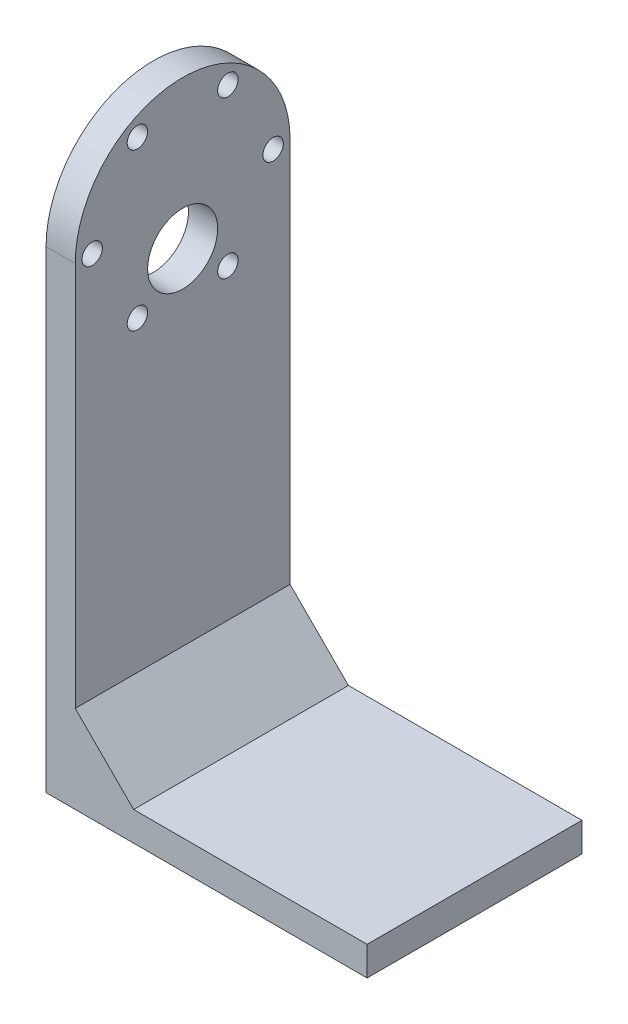
ISO-10303-21;
HEADER;
FILE_DESCRIPTION(('STEP AP214'),'2;1');
FILE_NAME('part.step','',(''),(''),'','','');
FILE_SCHEMA(('AUTOMOTIVE_DESIGN { 1 0 10303 214 1 1 1 1 }'));
ENDSEC;
DATA;
#1=APPLICATION_CONTEXT('core data for automotive mechanical design processes');
#2=APPLICATION_PROTOCOL_DEFINITION('international standard','automotive_design',2000,#1);
#3=PRODUCT_CONTEXT('',#1,'mechanical');
#4=PRODUCT('Part','Part','',(#3));
#5=PRODUCT_RELATED_PRODUCT_CATEGORY('part','',(#4));
#6=PRODUCT_DEFINITION_FORMATION('','',#4);
#7=PRODUCT_DEFINITION_CONTEXT('part definition',#1,'design');
#8=PRODUCT_DEFINITION('design','',#6,#7);
#9=PRODUCT_DEFINITION_SHAPE('','',#8);
#10=(LENGTH_UNIT() NAMED_UNIT(*) SI_UNIT(.MILLI.,.METRE.));
#11=(NAMED_UNIT(*) PLANE_ANGLE_UNIT() SI_UNIT($,.RADIAN.));
#12=(NAMED_UNIT(*) SI_UNIT($,.STERADIAN.) SOLID_ANGLE_UNIT());
#13=UNCERTAINTY_MEASURE_WITH_UNIT(LENGTH_MEASURE(1.E-05),#10,'distance_accuracy_value','');
#14=(GEOMETRIC_REPRESENTATION_CONTEXT(3) GLOBAL_UNCERTAINTY_ASSIGNED_CONTEXT((#13)) GLOBAL_UNIT_ASSIGNED_CONTEXT((#10,
#11,#12)) REPRESENTATION_CONTEXT('',''));
#15=CARTESIAN_POINT('',(0.,0.,0.));
#16=DIRECTION('',(0.,0.,1.));
#17=DIRECTION('',(1.,0.,0.));
#18=AXIS2_PLACEMENT_3D('',#15,#16,#17);
#19=CARTESIAN_POINT('',(747.608350006084,0.,1104.06011138059));
#20=DIRECTION('',(0.,0.,1.));
#21=DIRECTION('',(1.,0.,0.));
#22=AXIS2_PLACEMENT_3D('',#19,#20,#21);
#23=PLANE('',#22);
#24=DIRECTION('',(0.,-1.,0.));
#25=VECTOR('',#24,1.);
#26=CARTESIAN_POINT('',(752.608350006084,0.,1104.06011138059));
#27=LINE('',#26,#25);
#28=CARTESIAN_POINT('',(752.608350006084,-1919.,1104.06011138059));
#29=VERTEX_POINT('',#28);
#30=CARTESIAN_POINT('',(752.608350006084,-1985.,1104.06011138059));
#31=VERTEX_POINT('',#30);
#32=EDGE_CURVE('E131',#29,#31,#27,.T.);
#33=ORIENTED_EDGE('',*,*,#32,.T.);
#34=DIRECTION('',(0.707106781186553,-0.707106781186542,0.));
#35=VECTOR('',#34,1.);
#36=CARTESIAN_POINT('',(-242.391649993915,-990.000000000014,1104.06011138059));
#37=LINE('',#36,#35);
#38=CARTESIAN_POINT('',(762.608350006084,-1995.,1104.06011138059));
#39=VERTEX_POINT('',#38);
#40=EDGE_CURVE('E52',#31,#39,#37,.T.);
#41=ORIENTED_EDGE('',*,*,#40,.T.);
#42=DIRECTION('',(-1.,0.,0.));
#43=VECTOR('',#42,1.);
#44=CARTESIAN_POINT('',(802.608350006084,-1995.,1104.06011138059));
#45=LINE('',#44,#43);
#46=CARTESIAN_POINT('',(802.608350006084,-1995.,1104.06011138059));
#47=VERTEX_POINT('',#46);
#48=EDGE_CURVE('E123',#47,#39,#45,.T.);
#49=ORIENTED_EDGE('',*,*,#48,.F.);
#50=DIRECTION('',(0.,-1.,0.));
#51=VECTOR('',#50,1.);
#52=CARTESIAN_POINT('',(802.608350006084,-2000.,1104.06011138059));
#53=LINE('',#52,#51);
#54=CARTESIAN_POINT('',(802.608350006084,-2000.,1104.06011138059));
#55=VERTEX_POINT('',#54);
#56=EDGE_CURVE('E118',#47,#55,#53,.T.);
#57=ORIENTED_EDGE('',*,*,#56,.T.);
#58=DIRECTION('',(1.,0.,0.));
#59=VECTOR('',#58,1.);
#60=CARTESIAN_POINT('',(747.608350006084,-2000.,1104.06011138059));
#61=LINE('',#60,#59);
#62=CARTESIAN_POINT('',(747.608350006084,-2000.,1104.06011138059));
#63=VERTEX_POINT('',#62);
#64=EDGE_CURVE('E101',#63,#55,#61,.T.);
#65=ORIENTED_EDGE('',*,*,#64,.F.);
#66=DIRECTION('',(0.,-1.,0.));
#67=VECTOR('',#66,1.);
#68=CARTESIAN_POINT('',(747.608350006084,0.,1104.06011138059));
#69=LINE('',#68,#67);
#70=CARTESIAN_POINT('',(747.608350006084,-1919.,1104.06011138059));
#71=VERTEX_POINT('',#70);
#72=EDGE_CURVE('E133',#71,#63,#69,.T.);
#73=ORIENTED_EDGE('',*,*,#72,.F.);
#74=DIRECTION('',(1.,0.,0.));
#75=VECTOR('',#74,1.);
#76=CARTESIAN_POINT('',(747.608350006084,-1919.,1104.06011138059));
#77=LINE('',#76,#75);
#78=EDGE_CURVE('E163',#71,#29,#77,.T.);
#79=ORIENTED_EDGE('',*,*,#78,.T.);
#80=EDGE_LOOP('',(#33,#41,#49,#57,#65,#73,#79));
#81=FACE_BOUND('',#80,.T.);
#82=ADVANCED_FACE('F43',(#81),#23,.F.);
#83=CARTESIAN_POINT('',(747.608350006086,-2000.,9.23829602285963E-13));
#84=DIRECTION('',(0.,1.,0.));
#85=DIRECTION('',(-1.,0.,0.));
#86=AXIS2_PLACEMENT_3D('',#83,#84,#85);
#87=PLANE('',#86);
#88=ORIENTED_EDGE('',*,*,#64,.T.);
#89=DIRECTION('',(0.,0.,1.));
#90=VECTOR('',#89,1.);
#91=CARTESIAN_POINT('',(802.608350006084,-2000.,1104.06011138059));
#92=LINE('',#91,#90);
#93=CARTESIAN_POINT('',(802.608350006084,-2000.,1140.86011138059));
#94=VERTEX_POINT('',#93);
#95=EDGE_CURVE('E105',#55,#94,#92,.T.);
#96=ORIENTED_EDGE('',*,*,#95,.T.);
#97=DIRECTION('',(1.,0.,0.));
#98=VECTOR('',#97,1.);
#99=CARTESIAN_POINT('',(747.608350006084,-2000.,1140.86011138059));
#100=LINE('',#99,#98);
#101=CARTESIAN_POINT('',(747.608350006084,-2000.,1140.86011138059));
#102=VERTEX_POINT('',#101);
#103=EDGE_CURVE('E111',#102,#94,#100,.T.);
#104=ORIENTED_EDGE('',*,*,#103,.F.);
#105=DIRECTION('',(0.,0.,1.));
#106=VECTOR('',#105,1.);
#107=CARTESIAN_POINT('',(747.608350006086,-2000.,9.23829602285963E-13));
#108=LINE('',#107,#106);
#109=EDGE_CURVE('E106',#63,#102,#108,.T.);
#110=ORIENTED_EDGE('',*,*,#109,.F.);
#111=EDGE_LOOP('',(#88,#96,#104,#110));
#112=FACE_BOUND('',#111,.T.);
#113=ADVANCED_FACE('F103',(#112),#87,.F.);
#114=CARTESIAN_POINT('',(747.608350006084,0.,1140.86011138059));
#115=DIRECTION('',(0.,0.,1.));
#116=DIRECTION('',(1.,0.,0.));
#117=AXIS2_PLACEMENT_3D('',#114,#115,#116);
#118=PLANE('',#117);
#119=DIRECTION('',(0.,-1.,0.));
#120=VECTOR('',#119,1.);
#121=CARTESIAN_POINT('',(752.608350006084,0.,1140.86011138059));
#122=LINE('',#121,#120);
#123=CARTESIAN_POINT('',(752.608350006084,-1919.,1140.86011138059));
#124=VERTEX_POINT('',#123);
#125=CARTESIAN_POINT('',(752.608350006084,-1985.,1140.86011138059));
#126=VERTEX_POINT('',#125);
#127=EDGE_CURVE('E165',#124,#126,#122,.T.);
#128=ORIENTED_EDGE('',*,*,#127,.F.);
#129=DIRECTION('',(1.,0.,0.));
#130=VECTOR('',#129,1.);
#131=CARTESIAN_POINT('',(747.608350006084,-1919.,1140.86011138059));
#132=LINE('',#131,#130);
#133=CARTESIAN_POINT('',(747.608350006084,-1919.,1140.86011138059));
#134=VERTEX_POINT('',#133);
#135=EDGE_CURVE('E192',#134,#124,#132,.T.);
#136=ORIENTED_EDGE('',*,*,#135,.F.);
#137=DIRECTION('',(0.,-1.,0.));
#138=VECTOR('',#137,1.);
#139=CARTESIAN_POINT('',(747.608350006084,0.,1140.86011138059));
#140=LINE('',#139,#138);
#141=EDGE_CURVE('E137',#134,#102,#140,.T.);
#142=ORIENTED_EDGE('',*,*,#141,.T.);
#143=ORIENTED_EDGE('',*,*,#103,.T.);
#144=DIRECTION('',(0.,1.,0.));
#145=VECTOR('',#144,1.);
#146=CARTESIAN_POINT('',(802.608350006084,-2000.,1140.86011138059));
#147=LINE('',#146,#145);
#148=CARTESIAN_POINT('',(802.608350006084,-1995.,1140.86011138059));
#149=VERTEX_POINT('',#148);
#150=EDGE_CURVE('E121',#94,#149,#147,.T.);
#151=ORIENTED_EDGE('',*,*,#150,.T.);
#152=DIRECTION('',(-1.,0.,0.));
#153=VECTOR('',#152,1.);
#154=CARTESIAN_POINT('',(802.608350006084,-1995.,1140.86011138059));
#155=LINE('',#154,#153);
#156=CARTESIAN_POINT('',(762.608350006084,-1995.,1140.86011138059));
#157=VERTEX_POINT('',#156);
#158=EDGE_CURVE('E129',#149,#157,#155,.T.);
#159=ORIENTED_EDGE('',*,*,#158,.T.);
#160=DIRECTION('',(-0.707106781186553,0.707106781186542,0.));
#161=VECTOR('',#160,1.);
#162=CARTESIAN_POINT('',(752.608350006084,-1985.,1140.86011138059));
#163=LINE('',#162,#161);
#164=EDGE_CURVE('E11',#157,#126,#163,.T.);
#165=ORIENTED_EDGE('',*,*,#164,.T.);
#166=EDGE_LOOP('',(#128,#136,#142,#143,#151,#159,#165));
#167=FACE_BOUND('',#166,.T.);
#168=ADVANCED_FACE('F212',(#167),#118,.T.);
#169=CARTESIAN_POINT('',(747.608350006084,-1932.42339375866,1114.71011138059));
#170=DIRECTION('',(1.,0.,0.));
#171=DIRECTION('',(0.,0.,-1.));
#172=AXIS2_PLACEMENT_3D('',#169,#170,#171);
#173=CYLINDRICAL_SURFACE('',#172,1.75000000000007);
#174=CARTESIAN_POINT('',(747.608350006084,-1932.42339375866,1114.71011138059));
#175=DIRECTION('',(-1.,0.,0.));
#176=DIRECTION('',(0.,0.,1.));
#177=AXIS2_PLACEMENT_3D('',#174,#175,#176);
#178=CIRCLE('',#177,1.75000000000007);
#179=CARTESIAN_POINT('',(747.608350006084,-1932.42339375866,1116.46011138059));
#180=VERTEX_POINT('',#179);
#181=EDGE_CURVE('E157',#180,#180,#178,.T.);
#182=ORIENTED_EDGE('',*,*,#181,.T.);
#183=EDGE_LOOP('',(#182));
#184=FACE_BOUND('',#183,.T.);
#185=CARTESIAN_POINT('',(752.608350006084,-1932.42339375866,1114.71011138059));
#186=DIRECTION('',(-1.,0.,0.));
#187=DIRECTION('',(0.,0.,1.));
#188=AXIS2_PLACEMENT_3D('',#185,#186,#187);
#189=CIRCLE('',#188,1.75000000000007);
#190=CARTESIAN_POINT('',(752.608350006084,-1932.42339375866,1116.46011138059));
#191=VERTEX_POINT('',#190);
#192=EDGE_CURVE('E185',#191,#191,#189,.T.);
#193=ORIENTED_EDGE('',*,*,#192,.F.);
#194=EDGE_LOOP('',(#193));
#195=FACE_BOUND('',#194,.T.);
#196=ADVANCED_FACE('F228',(#184,#195),#173,.F.);
#197=CARTESIAN_POINT('',(747.608350006084,-1932.42339375866,1130.21011138059));
#198=DIRECTION('',(1.,0.,0.));
#199=DIRECTION('',(0.,0.,-1.));
#200=AXIS2_PLACEMENT_3D('',#197,#198,#199);
#201=CYLINDRICAL_SURFACE('',#200,1.75000000000007);
#202=CARTESIAN_POINT('',(747.608350006084,-1932.42339375866,1130.21011138059));
#203=DIRECTION('',(-1.,0.,0.));
#204=DIRECTION('',(0.,0.,1.));
#205=AXIS2_PLACEMENT_3D('',#202,#203,#204);
#206=CIRCLE('',#205,1.75000000000007);
#207=CARTESIAN_POINT('',(747.608350006084,-1932.42339375866,1131.96011138059));
#208=VERTEX_POINT('',#207);
#209=EDGE_CURVE('E154',#208,#208,#206,.T.);
#210=ORIENTED_EDGE('',*,*,#209,.T.);
#211=EDGE_LOOP('',(#210));
#212=FACE_BOUND('',#211,.T.);
#213=CARTESIAN_POINT('',(752.608350006084,-1932.42339375866,1130.21011138059));
#214=DIRECTION('',(-1.,0.,0.));
#215=DIRECTION('',(0.,0.,1.));
#216=AXIS2_PLACEMENT_3D('',#213,#214,#215);
#217=CIRCLE('',#216,1.75000000000007);
#218=CARTESIAN_POINT('',(752.608350006084,-1932.42339375866,1131.96011138059));
#219=VERTEX_POINT('',#218);
#220=EDGE_CURVE('E182',#219,#219,#217,.T.);
#221=ORIENTED_EDGE('',*,*,#220,.F.);
#222=EDGE_LOOP('',(#221));
#223=FACE_BOUND('',#222,.T.);
#224=ADVANCED_FACE('F247',(#212,#223),#201,.F.);
#225=CARTESIAN_POINT('',(747.608350006084,-1919.,1137.96011138059));
#226=DIRECTION('',(1.,0.,0.));
#227=DIRECTION('',(0.,0.,-1.));
#228=AXIS2_PLACEMENT_3D('',#225,#226,#227);
#229=CYLINDRICAL_SURFACE('',#228,1.74999999999986);
#230=CARTESIAN_POINT('',(747.608350006084,-1919.,1137.96011138059));
#231=DIRECTION('',(-1.,0.,0.));
#232=DIRECTION('',(0.,0.,1.));
#233=AXIS2_PLACEMENT_3D('',#230,#231,#232);
#234=CIRCLE('',#233,1.74999999999986);
#235=CARTESIAN_POINT('',(747.608350006084,-1919.,1139.71011138059));
#236=VERTEX_POINT('',#235);
#237=EDGE_CURVE('E151',#236,#236,#234,.T.);
#238=ORIENTED_EDGE('',*,*,#237,.T.);
#239=EDGE_LOOP('',(#238));
#240=FACE_BOUND('',#239,.T.);
#241=CARTESIAN_POINT('',(752.608350006084,-1919.,1137.96011138059));
#242=DIRECTION('',(-1.,0.,0.));
#243=DIRECTION('',(0.,0.,1.));
#244=AXIS2_PLACEMENT_3D('',#241,#242,#243);
#245=CIRCLE('',#244,1.74999999999986);
#246=CARTESIAN_POINT('',(752.608350006084,-1919.,1139.71011138059));
#247=VERTEX_POINT('',#246);
#248=EDGE_CURVE('E179',#247,#247,#245,.T.);
#249=ORIENTED_EDGE('',*,*,#248,.F.);
#250=EDGE_LOOP('',(#249));
#251=FACE_BOUND('',#250,.T.);
#252=ADVANCED_FACE('F243',(#240,#251),#229,.F.);
#253=CARTESIAN_POINT('',(747.608350006084,-1905.57660624134,1130.21011138059));
#254=DIRECTION('',(1.,0.,0.));
#255=DIRECTION('',(0.,0.,-1.));
#256=AXIS2_PLACEMENT_3D('',#253,#254,#255);
#257=CYLINDRICAL_SURFACE('',#256,1.74999999999986);
#258=CARTESIAN_POINT('',(747.608350006084,-1905.57660624134,1130.21011138059));
#259=DIRECTION('',(-1.,0.,0.));
#260=DIRECTION('',(0.,0.,1.));
#261=AXIS2_PLACEMENT_3D('',#258,#259,#260);
#262=CIRCLE('',#261,1.74999999999986);
#263=CARTESIAN_POINT('',(747.608350006084,-1905.57660624134,1131.96011138059));
#264=VERTEX_POINT('',#263);
#265=EDGE_CURVE('E148',#264,#264,#262,.T.);
#266=ORIENTED_EDGE('',*,*,#265,.T.);
#267=EDGE_LOOP('',(#266));
#268=FACE_BOUND('',#267,.T.);
#269=CARTESIAN_POINT('',(752.608350006084,-1905.57660624134,1130.21011138059));
#270=DIRECTION('',(-1.,0.,0.));
#271=DIRECTION('',(0.,0.,1.));
#272=AXIS2_PLACEMENT_3D('',#269,#270,#271);
#273=CIRCLE('',#272,1.74999999999986);
#274=CARTESIAN_POINT('',(752.608350006084,-1905.57660624134,1131.96011138059));
#275=VERTEX_POINT('',#274);
#276=EDGE_CURVE('E176',#275,#275,#273,.T.);
#277=ORIENTED_EDGE('',*,*,#276,.F.);
#278=EDGE_LOOP('',(#277));
#279=FACE_BOUND('',#278,.T.);
#280=ADVANCED_FACE('F239',(#268,#279),#257,.F.);
#281=CARTESIAN_POINT('',(747.608350006084,-1905.57660624134,1114.71011138059));
#282=DIRECTION('',(1.,0.,0.));
#283=DIRECTION('',(0.,0.,-1.));
#284=AXIS2_PLACEMENT_3D('',#281,#282,#283);
#285=CYLINDRICAL_SURFACE('',#284,1.75000000000007);
#286=CARTESIAN_POINT('',(747.608350006084,-1905.57660624134,1114.71011138059));
#287=DIRECTION('',(-1.,0.,0.));
#288=DIRECTION('',(0.,0.,1.));
#289=AXIS2_PLACEMENT_3D('',#286,#287,#288);
#290=CIRCLE('',#289,1.75000000000007);
#291=CARTESIAN_POINT('',(747.608350006084,-1905.57660624134,1116.46011138059));
#292=VERTEX_POINT('',#291);
#293=EDGE_CURVE('E145',#292,#292,#290,.T.);
#294=ORIENTED_EDGE('',*,*,#293,.T.);
#295=EDGE_LOOP('',(#294));
#296=FACE_BOUND('',#295,.T.);
#297=CARTESIAN_POINT('',(752.608350006084,-1905.57660624134,1114.71011138059));
#298=DIRECTION('',(-1.,0.,0.));
#299=DIRECTION('',(0.,0.,1.));
#300=AXIS2_PLACEMENT_3D('',#297,#298,#299);
#301=CIRCLE('',#300,1.75000000000007);
#302=CARTESIAN_POINT('',(752.608350006084,-1905.57660624134,1116.46011138059));
#303=VERTEX_POINT('',#302);
#304=EDGE_CURVE('E173',#303,#303,#301,.T.);
#305=ORIENTED_EDGE('',*,*,#304,.F.);
#306=EDGE_LOOP('',(#305));
#307=FACE_BOUND('',#306,.T.);
#308=ADVANCED_FACE('F235',(#296,#307),#285,.F.);
#309=CARTESIAN_POINT('',(747.608350006084,-1919.,1106.96011138059));
#310=DIRECTION('',(1.,0.,0.));
#311=DIRECTION('',(0.,0.,-1.));
#312=AXIS2_PLACEMENT_3D('',#309,#310,#311);
#313=CYLINDRICAL_SURFACE('',#312,1.75000000000007);
#314=CARTESIAN_POINT('',(747.608350006084,-1919.,1106.96011138059));
#315=DIRECTION('',(-1.,0.,0.));
#316=DIRECTION('',(0.,0.,1.));
#317=AXIS2_PLACEMENT_3D('',#314,#315,#316);
#318=CIRCLE('',#317,1.75000000000007);
#319=CARTESIAN_POINT('',(747.608350006084,-1919.,1108.71011138059));
#320=VERTEX_POINT('',#319);
#321=EDGE_CURVE('E142',#320,#320,#318,.T.);
#322=ORIENTED_EDGE('',*,*,#321,.T.);
#323=EDGE_LOOP('',(#322));
#324=FACE_BOUND('',#323,.T.);
#325=CARTESIAN_POINT('',(752.608350006084,-1919.,1106.96011138059));
#326=DIRECTION('',(-1.,0.,0.));
#327=DIRECTION('',(0.,0.,1.));
#328=AXIS2_PLACEMENT_3D('',#325,#326,#327);
#329=CIRCLE('',#328,1.75000000000007);
#330=CARTESIAN_POINT('',(752.608350006084,-1919.,1108.71011138059));
#331=VERTEX_POINT('',#330);
#332=EDGE_CURVE('E170',#331,#331,#329,.T.);
#333=ORIENTED_EDGE('',*,*,#332,.F.);
#334=EDGE_LOOP('',(#333));
#335=FACE_BOUND('',#334,.T.);
#336=ADVANCED_FACE('F232',(#324,#335),#313,.F.);
#337=CARTESIAN_POINT('',(747.608350006084,-1919.,1122.46011138059));
#338=DIRECTION('',(1.,0.,0.));
#339=DIRECTION('',(0.,0.,-1.));
#340=AXIS2_PLACEMENT_3D('',#337,#338,#339);
#341=CYLINDRICAL_SURFACE('',#340,18.4);
#342=CARTESIAN_POINT('',(752.608350006084,-1919.,1122.46011138059));
#343=DIRECTION('',(-1.,0.,0.));
#344=DIRECTION('',(0.,0.,1.));
#345=AXIS2_PLACEMENT_3D('',#342,#343,#344);
#346=CIRCLE('',#345,18.4);
#347=EDGE_CURVE('E168',#124,#29,#346,.T.);
#348=ORIENTED_EDGE('',*,*,#347,.T.);
#349=ORIENTED_EDGE('',*,*,#78,.F.);
#350=CARTESIAN_POINT('',(747.608350006084,-1919.,1122.46011138059));
#351=DIRECTION('',(-1.,0.,0.));
#352=DIRECTION('',(0.,0.,1.));
#353=AXIS2_PLACEMENT_3D('',#350,#351,#352);
#354=CIRCLE('',#353,18.4);
#355=EDGE_CURVE('E140',#134,#71,#354,.T.);
#356=ORIENTED_EDGE('',*,*,#355,.F.);
#357=ORIENTED_EDGE('',*,*,#135,.T.);
#358=EDGE_LOOP('',(#348,#349,#356,#357));
#359=FACE_BOUND('',#358,.T.);
#360=ADVANCED_FACE('F209',(#359),#341,.T.);
#361=CARTESIAN_POINT('',(747.608350006084,-1926.,1122.46011138059));
#362=DIRECTION('',(1.,0.,0.));
#363=DIRECTION('',(0.,0.,-1.));
#364=AXIS2_PLACEMENT_3D('',#361,#362,#363);
#365=CYLINDRICAL_SURFACE('',#364,6.);
#366=CARTESIAN_POINT('',(747.608350006084,-1926.,1122.46011138059));
#367=DIRECTION('',(-1.,0.,0.));
#368=DIRECTION('',(0.,0.,1.));
#369=AXIS2_PLACEMENT_3D('',#366,#367,#368);
#370=CIRCLE('',#369,6.);
#371=CARTESIAN_POINT('',(747.608350006084,-1926.,1128.46011138059));
#372=VERTEX_POINT('',#371);
#373=EDGE_CURVE('E160',#372,#372,#370,.F.);
#374=ORIENTED_EDGE('',*,*,#373,.F.);
#375=EDGE_LOOP('',(#374));
#376=FACE_BOUND('',#375,.T.);
#377=CARTESIAN_POINT('',(752.608350006084,-1926.,1122.46011138059));
#378=DIRECTION('',(-1.,0.,0.));
#379=DIRECTION('',(0.,0.,1.));
#380=AXIS2_PLACEMENT_3D('',#377,#378,#379);
#381=CIRCLE('',#380,6.);
#382=CARTESIAN_POINT('',(752.608350006084,-1926.,1128.46011138059));
#383=VERTEX_POINT('',#382);
#384=EDGE_CURVE('E135',#383,#383,#381,.F.);
#385=ORIENTED_EDGE('',*,*,#384,.T.);
#386=EDGE_LOOP('',(#385));
#387=FACE_BOUND('',#386,.T.);
#388=ADVANCED_FACE('F231',(#376,#387),#365,.F.);
#389=CARTESIAN_POINT('',(747.608350006086,0.,9.23829602285963E-13));
#390=DIRECTION('',(-1.,0.,0.));
#391=DIRECTION('',(0.,0.,1.));
#392=AXIS2_PLACEMENT_3D('',#389,#390,#391);
#393=PLANE('',#392);
#394=ORIENTED_EDGE('',*,*,#72,.T.);
#395=ORIENTED_EDGE('',*,*,#109,.T.);
#396=ORIENTED_EDGE('',*,*,#141,.F.);
#397=ORIENTED_EDGE('',*,*,#355,.T.);
#398=EDGE_LOOP('',(#394,#395,#396,#397));
#399=FACE_BOUND('',#398,.T.);
#400=ORIENTED_EDGE('',*,*,#321,.F.);
#401=EDGE_LOOP('',(#400));
#402=FACE_BOUND('',#401,.T.);
#403=ORIENTED_EDGE('',*,*,#293,.F.);
#404=EDGE_LOOP('',(#403));
#405=FACE_BOUND('',#404,.T.);
#406=ORIENTED_EDGE('',*,*,#265,.F.);
#407=EDGE_LOOP('',(#406));
#408=FACE_BOUND('',#407,.T.);
#409=ORIENTED_EDGE('',*,*,#237,.F.);
#410=EDGE_LOOP('',(#409));
#411=FACE_BOUND('',#410,.T.);
#412=ORIENTED_EDGE('',*,*,#209,.F.);
#413=EDGE_LOOP('',(#412));
#414=FACE_BOUND('',#413,.T.);
#415=ORIENTED_EDGE('',*,*,#181,.F.);
#416=EDGE_LOOP('',(#415));
#417=FACE_BOUND('',#416,.T.);
#418=ORIENTED_EDGE('',*,*,#373,.T.);
#419=EDGE_LOOP('',(#418));
#420=FACE_BOUND('',#419,.T.);
#421=ADVANCED_FACE('F257',(#399,#402,#405,#408,#411,#414,#417,#420),#393,.T.);
#422=CARTESIAN_POINT('',(752.608350006086,0.,9.29224286181948E-13));
#423=DIRECTION('',(-1.,0.,0.));
#424=DIRECTION('',(0.,0.,1.));
#425=AXIS2_PLACEMENT_3D('',#422,#423,#424);
#426=PLANE('',#425);
#427=ORIENTED_EDGE('',*,*,#127,.T.);
#428=DIRECTION('',(0.,0.,-1.));
#429=VECTOR('',#428,1.);
#430=CARTESIAN_POINT('',(752.608350006086,-1985.,9.29224286181948E-13));
#431=LINE('',#430,#429);
#432=EDGE_CURVE('E110',#126,#31,#431,.T.);
#433=ORIENTED_EDGE('',*,*,#432,.T.);
#434=ORIENTED_EDGE('',*,*,#32,.F.);
#435=ORIENTED_EDGE('',*,*,#347,.F.);
#436=EDGE_LOOP('',(#427,#433,#434,#435));
#437=FACE_BOUND('',#436,.T.);
#438=ORIENTED_EDGE('',*,*,#332,.T.);
#439=EDGE_LOOP('',(#438));
#440=FACE_BOUND('',#439,.T.);
#441=ORIENTED_EDGE('',*,*,#304,.T.);
#442=EDGE_LOOP('',(#441));
#443=FACE_BOUND('',#442,.T.);
#444=ORIENTED_EDGE('',*,*,#276,.T.);
#445=EDGE_LOOP('',(#444));
#446=FACE_BOUND('',#445,.T.);
#447=ORIENTED_EDGE('',*,*,#248,.T.);
#448=EDGE_LOOP('',(#447));
#449=FACE_BOUND('',#448,.T.);
#450=ORIENTED_EDGE('',*,*,#220,.T.);
#451=EDGE_LOOP('',(#450));
#452=FACE_BOUND('',#451,.T.);
#453=ORIENTED_EDGE('',*,*,#192,.T.);
#454=EDGE_LOOP('',(#453));
#455=FACE_BOUND('',#454,.T.);
#456=ORIENTED_EDGE('',*,*,#384,.F.);
#457=EDGE_LOOP('',(#456));
#458=FACE_BOUND('',#457,.T.);
#459=ADVANCED_FACE('F200',(#437,#440,#443,#446,#449,#452,#455,#458),#426,.F.);
#460=CARTESIAN_POINT('',(802.608350006084,-1995.,1104.06011138059));
#461=DIRECTION('',(0.,1.,0.));
#462=DIRECTION('',(0.,0.,1.));
#463=AXIS2_PLACEMENT_3D('',#460,#461,#462);
#464=PLANE('',#463);
#465=ORIENTED_EDGE('',*,*,#48,.T.);
#466=DIRECTION('',(0.,0.,1.));
#467=VECTOR('',#466,1.);
#468=CARTESIAN_POINT('',(762.608350006084,-1995.,1104.06011138059));
#469=LINE('',#468,#467);
#470=EDGE_CURVE('E65',#39,#157,#469,.T.);
#471=ORIENTED_EDGE('',*,*,#470,.T.);
#472=ORIENTED_EDGE('',*,*,#158,.F.);
#473=DIRECTION('',(0.,0.,-1.));
#474=VECTOR('',#473,1.);
#475=CARTESIAN_POINT('',(802.608350006084,-1995.,1104.06011138059));
#476=LINE('',#475,#474);
#477=EDGE_CURVE('E127',#149,#47,#476,.T.);
#478=ORIENTED_EDGE('',*,*,#477,.T.);
#479=EDGE_LOOP('',(#465,#471,#472,#478));
#480=FACE_BOUND('',#479,.T.);
#481=ADVANCED_FACE('F218',(#480),#464,.T.);
#482=CARTESIAN_POINT('',(802.608350006088,0.,2.33320505232839E-12));
#483=DIRECTION('',(1.,0.,0.));
#484=DIRECTION('',(0.,0.,-1.));
#485=AXIS2_PLACEMENT_3D('',#482,#483,#484);
#486=PLANE('',#485);
#487=ORIENTED_EDGE('',*,*,#56,.F.);
#488=ORIENTED_EDGE('',*,*,#477,.F.);
#489=ORIENTED_EDGE('',*,*,#150,.F.);
#490=ORIENTED_EDGE('',*,*,#95,.F.);
#491=EDGE_LOOP('',(#487,#488,#489,#490));
#492=FACE_BOUND('',#491,.T.);
#493=ADVANCED_FACE('F116',(#492),#486,.T.);
#494=CARTESIAN_POINT('',(752.608350006086,-1985.,9.29224286181948E-13));
#495=DIRECTION('',(-0.707106781186542,-0.707106781186553,0.));
#496=DIRECTION('',(0.,0.,-1.));
#497=AXIS2_PLACEMENT_3D('',#494,#495,#496);
#498=PLANE('',#497);
#499=ORIENTED_EDGE('',*,*,#164,.F.);
#500=ORIENTED_EDGE('',*,*,#470,.F.);
#501=ORIENTED_EDGE('',*,*,#40,.F.);
#502=ORIENTED_EDGE('',*,*,#432,.F.);
#503=EDGE_LOOP('',(#499,#500,#501,#502));
#504=FACE_BOUND('',#503,.T.);
#505=ADVANCED_FACE('F46',(#504),#498,.F.);
#506=CLOSED_SHELL('',(#82,#113,#168,#196,#224,#252,#280,#308,#336,#360,#388,#421,#459,#481,#493,#505));
#507=MANIFOLD_SOLID_BREP('B2',#506);
#508=ADVANCED_BREP_SHAPE_REPRESENTATION('',(#18,#507),#14);
#509=SHAPE_DEFINITION_REPRESENTATION(#9,#508);
ENDSEC;
END-ISO-10303-21;
